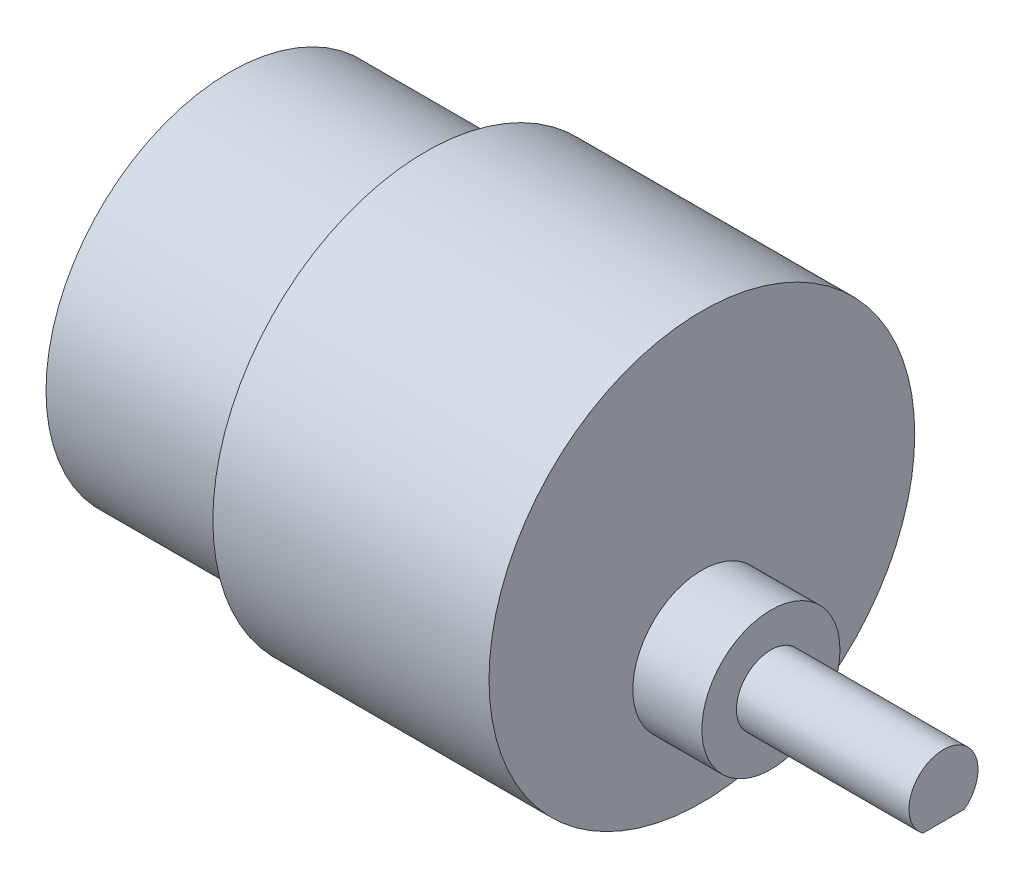
ISO-10303-21;
HEADER;
FILE_DESCRIPTION(('STEP AP214'),'2;1');
FILE_NAME('part.step','',(''),(''),'','','');
FILE_SCHEMA(('AUTOMOTIVE_DESIGN { 1 0 10303 214 1 1 1 1 }'));
ENDSEC;
DATA;
#1=APPLICATION_CONTEXT('core data for automotive mechanical design processes');
#2=APPLICATION_PROTOCOL_DEFINITION('international standard','automotive_design',2000,#1);
#3=PRODUCT_CONTEXT('',#1,'mechanical');
#4=PRODUCT('Part','Part','',(#3));
#5=PRODUCT_RELATED_PRODUCT_CATEGORY('part','',(#4));
#6=PRODUCT_DEFINITION_FORMATION('','',#4);
#7=PRODUCT_DEFINITION_CONTEXT('part definition',#1,'design');
#8=PRODUCT_DEFINITION('design','',#6,#7);
#9=PRODUCT_DEFINITION_SHAPE('','',#8);
#10=(LENGTH_UNIT() NAMED_UNIT(*) SI_UNIT(.MILLI.,.METRE.));
#11=(NAMED_UNIT(*) PLANE_ANGLE_UNIT() SI_UNIT($,.RADIAN.));
#12=(NAMED_UNIT(*) SI_UNIT($,.STERADIAN.) SOLID_ANGLE_UNIT());
#13=UNCERTAINTY_MEASURE_WITH_UNIT(LENGTH_MEASURE(1.E-05),#10,'distance_accuracy_value','');
#14=(GEOMETRIC_REPRESENTATION_CONTEXT(3) GLOBAL_UNCERTAINTY_ASSIGNED_CONTEXT((#13)) GLOBAL_UNIT_ASSIGNED_CONTEXT((#10,
#11,#12)) REPRESENTATION_CONTEXT('',''));
#15=CARTESIAN_POINT('',(0.,0.,0.));
#16=DIRECTION('',(0.,0.,1.));
#17=DIRECTION('',(1.,0.,0.));
#18=AXIS2_PLACEMENT_3D('',#15,#16,#17);
#19=CARTESIAN_POINT('',(24.,0.,0.));
#20=DIRECTION('',(-1.,0.,0.));
#21=DIRECTION('',(0.,0.,1.));
#22=AXIS2_PLACEMENT_3D('',#19,#20,#21);
#23=CYLINDRICAL_SURFACE('',#22,18.5);
#24=CARTESIAN_POINT('',(24.,0.,0.));
#25=DIRECTION('',(1.,0.,0.));
#26=DIRECTION('',(0.,0.,-1.));
#27=AXIS2_PLACEMENT_3D('',#24,#25,#26);
#28=CIRCLE('',#27,18.5);
#29=CARTESIAN_POINT('',(24.,0.,-18.5));
#30=VERTEX_POINT('',#29);
#31=EDGE_CURVE('E107',#30,#30,#28,.T.);
#32=ORIENTED_EDGE('',*,*,#31,.F.);
#33=EDGE_LOOP('',(#32));
#34=FACE_BOUND('',#33,.T.);
#35=CARTESIAN_POINT('',(0.,0.,0.));
#36=DIRECTION('',(1.,0.,0.));
#37=DIRECTION('',(0.,0.,-1.));
#38=AXIS2_PLACEMENT_3D('',#35,#36,#37);
#39=CIRCLE('',#38,18.5);
#40=CARTESIAN_POINT('',(0.,0.,-18.5));
#41=VERTEX_POINT('',#40);
#42=EDGE_CURVE('E103',#41,#41,#39,.T.);
#43=ORIENTED_EDGE('',*,*,#42,.T.);
#44=EDGE_LOOP('',(#43));
#45=FACE_BOUND('',#44,.T.);
#46=ADVANCED_FACE('F39',(#34,#45),#23,.T.);
#47=CARTESIAN_POINT('',(24.,0.,0.));
#48=DIRECTION('',(1.,0.,0.));
#49=DIRECTION('',(0.,0.,-1.));
#50=AXIS2_PLACEMENT_3D('',#47,#48,#49);
#51=PLANE('',#50);
#52=CARTESIAN_POINT('',(24.,-7.,0.));
#53=DIRECTION('',(1.,0.,0.));
#54=DIRECTION('',(0.,0.,-1.));
#55=AXIS2_PLACEMENT_3D('',#52,#53,#54);
#56=CIRCLE('',#55,6.);
#57=CARTESIAN_POINT('',(24.,-7.,-6.));
#58=VERTEX_POINT('',#57);
#59=EDGE_CURVE('E83',#58,#58,#56,.T.);
#60=ORIENTED_EDGE('',*,*,#59,.F.);
#61=EDGE_LOOP('',(#60));
#62=FACE_BOUND('',#61,.T.);
#63=ORIENTED_EDGE('',*,*,#31,.T.);
#64=EDGE_LOOP('',(#63));
#65=FACE_BOUND('',#64,.T.);
#66=ADVANCED_FACE('F119',(#62,#65),#51,.T.);
#67=CARTESIAN_POINT('',(0.,0.,0.));
#68=DIRECTION('',(1.,0.,0.));
#69=DIRECTION('',(0.,0.,-1.));
#70=AXIS2_PLACEMENT_3D('',#67,#68,#69);
#71=PLANE('',#70);
#72=CARTESIAN_POINT('',(0.,0.,0.));
#73=DIRECTION('',(-1.,0.,0.));
#74=DIRECTION('',(0.,0.,1.));
#75=AXIS2_PLACEMENT_3D('',#72,#73,#74);
#76=CIRCLE('',#75,16.);
#77=CARTESIAN_POINT('',(0.,0.,16.));
#78=VERTEX_POINT('',#77);
#79=EDGE_CURVE('E95',#78,#78,#76,.T.);
#80=ORIENTED_EDGE('',*,*,#79,.F.);
#81=EDGE_LOOP('',(#80));
#82=FACE_BOUND('',#81,.T.);
#83=ORIENTED_EDGE('',*,*,#42,.F.);
#84=EDGE_LOOP('',(#83));
#85=FACE_BOUND('',#84,.T.);
#86=ADVANCED_FACE('F116',(#82,#85),#71,.F.);
#87=CARTESIAN_POINT('',(-17.,0.,0.));
#88=DIRECTION('',(1.,0.,0.));
#89=DIRECTION('',(0.,0.,-1.));
#90=AXIS2_PLACEMENT_3D('',#87,#88,#89);
#91=CYLINDRICAL_SURFACE('',#90,16.);
#92=CARTESIAN_POINT('',(-17.,0.,0.));
#93=DIRECTION('',(-1.,0.,0.));
#94=DIRECTION('',(0.,0.,1.));
#95=AXIS2_PLACEMENT_3D('',#92,#93,#94);
#96=CIRCLE('',#95,16.);
#97=CARTESIAN_POINT('',(-17.,0.,16.));
#98=VERTEX_POINT('',#97);
#99=EDGE_CURVE('E98',#98,#98,#96,.T.);
#100=ORIENTED_EDGE('',*,*,#99,.F.);
#101=EDGE_LOOP('',(#100));
#102=FACE_BOUND('',#101,.T.);
#103=ORIENTED_EDGE('',*,*,#79,.T.);
#104=EDGE_LOOP('',(#103));
#105=FACE_BOUND('',#104,.T.);
#106=ADVANCED_FACE('F118',(#102,#105),#91,.T.);
#107=CARTESIAN_POINT('',(-17.,0.,0.));
#108=DIRECTION('',(-1.,0.,0.));
#109=DIRECTION('',(0.,0.,1.));
#110=AXIS2_PLACEMENT_3D('',#107,#108,#109);
#111=PLANE('',#110);
#112=CARTESIAN_POINT('',(-17.,0.,0.));
#113=DIRECTION('',(-1.,0.,0.));
#114=DIRECTION('',(0.,0.,1.));
#115=AXIS2_PLACEMENT_3D('',#112,#113,#114);
#116=CIRCLE('',#115,3.75);
#117=CARTESIAN_POINT('',(-17.,0.,3.75));
#118=VERTEX_POINT('',#117);
#119=EDGE_CURVE('E11',#118,#118,#116,.T.);
#120=ORIENTED_EDGE('',*,*,#119,.F.);
#121=EDGE_LOOP('',(#120));
#122=FACE_BOUND('',#121,.T.);
#123=ORIENTED_EDGE('',*,*,#99,.T.);
#124=EDGE_LOOP('',(#123));
#125=FACE_BOUND('',#124,.T.);
#126=ADVANCED_FACE('F125',(#122,#125),#111,.T.);
#127=CARTESIAN_POINT('',(30.,-7.,0.));
#128=DIRECTION('',(-1.,0.,0.));
#129=DIRECTION('',(0.,0.,1.));
#130=AXIS2_PLACEMENT_3D('',#127,#128,#129);
#131=CYLINDRICAL_SURFACE('',#130,6.);
#132=CARTESIAN_POINT('',(30.,-7.,0.));
#133=DIRECTION('',(1.,0.,0.));
#134=DIRECTION('',(0.,0.,-1.));
#135=AXIS2_PLACEMENT_3D('',#132,#133,#134);
#136=CIRCLE('',#135,6.);
#137=CARTESIAN_POINT('',(30.,-7.,-6.));
#138=VERTEX_POINT('',#137);
#139=EDGE_CURVE('E88',#138,#138,#136,.T.);
#140=ORIENTED_EDGE('',*,*,#139,.F.);
#141=EDGE_LOOP('',(#140));
#142=FACE_BOUND('',#141,.T.);
#143=ORIENTED_EDGE('',*,*,#59,.T.);
#144=EDGE_LOOP('',(#143));
#145=FACE_BOUND('',#144,.T.);
#146=ADVANCED_FACE('F150',(#142,#145),#131,.T.);
#147=CARTESIAN_POINT('',(30.,-7.,0.));
#148=DIRECTION('',(1.,0.,0.));
#149=DIRECTION('',(0.,0.,-1.));
#150=AXIS2_PLACEMENT_3D('',#147,#148,#149);
#151=PLANE('',#150);
#152=CARTESIAN_POINT('',(30.,-7.,0.));
#153=DIRECTION('',(1.,0.,0.));
#154=DIRECTION('',(0.,0.,-1.));
#155=AXIS2_PLACEMENT_3D('',#152,#153,#154);
#156=CIRCLE('',#155,3.);
#157=CARTESIAN_POINT('',(30.,-7.,-3.));
#158=VERTEX_POINT('',#157);
#159=EDGE_CURVE('E72',#158,#158,#156,.T.);
#160=ORIENTED_EDGE('',*,*,#159,.F.);
#161=EDGE_LOOP('',(#160));
#162=FACE_BOUND('',#161,.T.);
#163=ORIENTED_EDGE('',*,*,#139,.T.);
#164=EDGE_LOOP('',(#163));
#165=FACE_BOUND('',#164,.T.);
#166=ADVANCED_FACE('F155',(#162,#165),#151,.T.);
#167=CARTESIAN_POINT('',(45.,-7.,0.));
#168=DIRECTION('',(-1.,0.,0.));
#169=DIRECTION('',(0.,0.,1.));
#170=AXIS2_PLACEMENT_3D('',#167,#168,#169);
#171=CYLINDRICAL_SURFACE('',#170,3.);
#172=CARTESIAN_POINT('',(45.,-7.,0.));
#173=DIRECTION('',(1.,0.,0.));
#174=DIRECTION('',(0.,0.,-1.));
#175=AXIS2_PLACEMENT_3D('',#172,#173,#174);
#176=CIRCLE('',#175,3.);
#177=CARTESIAN_POINT('',(45.,-9.4,-1.8));
#178=VERTEX_POINT('',#177);
#179=CARTESIAN_POINT('',(45.,-9.4,1.8));
#180=VERTEX_POINT('',#179);
#181=EDGE_CURVE('E77',#178,#180,#176,.T.);
#182=ORIENTED_EDGE('',*,*,#181,.F.);
#183=DIRECTION('',(-1.,0.,0.));
#184=VECTOR('',#183,1.);
#185=CARTESIAN_POINT('',(45.,-9.4,-1.8));
#186=LINE('',#185,#184);
#187=CARTESIAN_POINT('',(34.,-9.4,-1.8));
#188=VERTEX_POINT('',#187);
#189=EDGE_CURVE('E55',#178,#188,#186,.T.);
#190=ORIENTED_EDGE('',*,*,#189,.T.);
#191=CARTESIAN_POINT('',(34.,-7.,0.));
#192=DIRECTION('',(1.,0.,0.));
#193=DIRECTION('',(0.,0.,-1.));
#194=AXIS2_PLACEMENT_3D('',#191,#192,#193);
#195=CIRCLE('',#194,3.);
#196=CARTESIAN_POINT('',(34.,-9.4,1.8));
#197=VERTEX_POINT('',#196);
#198=EDGE_CURVE('E42',#197,#188,#195,.T.);
#199=ORIENTED_EDGE('',*,*,#198,.F.);
#200=DIRECTION('',(-1.,0.,0.));
#201=VECTOR('',#200,1.);
#202=CARTESIAN_POINT('',(45.,-9.4,1.8));
#203=LINE('',#202,#201);
#204=EDGE_CURVE('E60',#197,#180,#203,.F.);
#205=ORIENTED_EDGE('',*,*,#204,.T.);
#206=EDGE_LOOP('',(#182,#190,#199,#205));
#207=FACE_BOUND('',#206,.T.);
#208=ORIENTED_EDGE('',*,*,#159,.T.);
#209=EDGE_LOOP('',(#208));
#210=FACE_BOUND('',#209,.T.);
#211=ADVANCED_FACE('F75',(#207,#210),#171,.T.);
#212=CARTESIAN_POINT('',(45.,-7.,0.));
#213=DIRECTION('',(1.,0.,0.));
#214=DIRECTION('',(0.,0.,-1.));
#215=AXIS2_PLACEMENT_3D('',#212,#213,#214);
#216=PLANE('',#215);
#217=DIRECTION('',(0.,0.,1.));
#218=VECTOR('',#217,1.);
#219=CARTESIAN_POINT('',(45.,-9.4,0.));
#220=LINE('',#219,#218);
#221=EDGE_CURVE('E66',#178,#180,#220,.T.);
#222=ORIENTED_EDGE('',*,*,#221,.F.);
#223=ORIENTED_EDGE('',*,*,#181,.T.);
#224=EDGE_LOOP('',(#222,#223));
#225=FACE_BOUND('',#224,.T.);
#226=ADVANCED_FACE('F81',(#225),#216,.T.);
#227=CARTESIAN_POINT('',(34.,0.,0.));
#228=DIRECTION('',(1.,0.,0.));
#229=DIRECTION('',(0.,0.,-1.));
#230=AXIS2_PLACEMENT_3D('',#227,#228,#229);
#231=PLANE('',#230);
#232=ORIENTED_EDGE('',*,*,#198,.T.);
#233=DIRECTION('',(0.,0.,1.));
#234=VECTOR('',#233,1.);
#235=CARTESIAN_POINT('',(34.,-9.4,3.5914177770321));
#236=LINE('',#235,#234);
#237=EDGE_CURVE('E79',#188,#197,#236,.T.);
#238=ORIENTED_EDGE('',*,*,#237,.T.);
#239=EDGE_LOOP('',(#232,#238));
#240=FACE_BOUND('',#239,.T.);
#241=ADVANCED_FACE('F184',(#240),#231,.T.);
#242=CARTESIAN_POINT('',(34.,-9.4,3.5914177770321));
#243=DIRECTION('',(0.,1.,0.));
#244=DIRECTION('',(0.,0.,1.));
#245=AXIS2_PLACEMENT_3D('',#242,#243,#244);
#246=PLANE('',#245);
#247=ORIENTED_EDGE('',*,*,#221,.T.);
#248=ORIENTED_EDGE('',*,*,#204,.F.);
#249=ORIENTED_EDGE('',*,*,#237,.F.);
#250=ORIENTED_EDGE('',*,*,#189,.F.);
#251=EDGE_LOOP('',(#247,#248,#249,#250));
#252=FACE_BOUND('',#251,.T.);
#253=ADVANCED_FACE('F67',(#252),#246,.F.);
#254=CARTESIAN_POINT('',(-22.5,0.,0.));
#255=DIRECTION('',(1.,0.,0.));
#256=DIRECTION('',(0.,0.,-1.));
#257=AXIS2_PLACEMENT_3D('',#254,#255,#256);
#258=CYLINDRICAL_SURFACE('',#257,3.75);
#259=CARTESIAN_POINT('',(-22.5,0.,0.));
#260=DIRECTION('',(-1.,0.,0.));
#261=DIRECTION('',(0.,0.,1.));
#262=AXIS2_PLACEMENT_3D('',#259,#260,#261);
#263=CIRCLE('',#262,3.75);
#264=CARTESIAN_POINT('',(-22.5,0.,3.75));
#265=VERTEX_POINT('',#264);
#266=EDGE_CURVE('E234',#265,#265,#263,.T.);
#267=ORIENTED_EDGE('',*,*,#266,.F.);
#268=EDGE_LOOP('',(#267));
#269=FACE_BOUND('',#268,.T.);
#270=ORIENTED_EDGE('',*,*,#119,.T.);
#271=EDGE_LOOP('',(#270));
#272=FACE_BOUND('',#271,.T.);
#273=ADVANCED_FACE('F202',(#269,#272),#258,.T.);
#274=CARTESIAN_POINT('',(-22.5,0.,0.));
#275=DIRECTION('',(-1.,0.,0.));
#276=DIRECTION('',(0.,0.,1.));
#277=AXIS2_PLACEMENT_3D('',#274,#275,#276);
#278=PLANE('',#277);
#279=ORIENTED_EDGE('',*,*,#266,.T.);
#280=EDGE_LOOP('',(#279));
#281=FACE_BOUND('',#280,.T.);
#282=ADVANCED_FACE('F218',(#281),#278,.T.);
#283=CLOSED_SHELL('',(#46,#66,#86,#106,#126,#146,#166,#211,#226,#241,#253,#273,#282));
#284=MANIFOLD_SOLID_BREP('B2',#283);
#285=ADVANCED_BREP_SHAPE_REPRESENTATION('',(#18,#284),#14);
#286=SHAPE_DEFINITION_REPRESENTATION(#9,#285);
ENDSEC;
END-ISO-10303-21;
